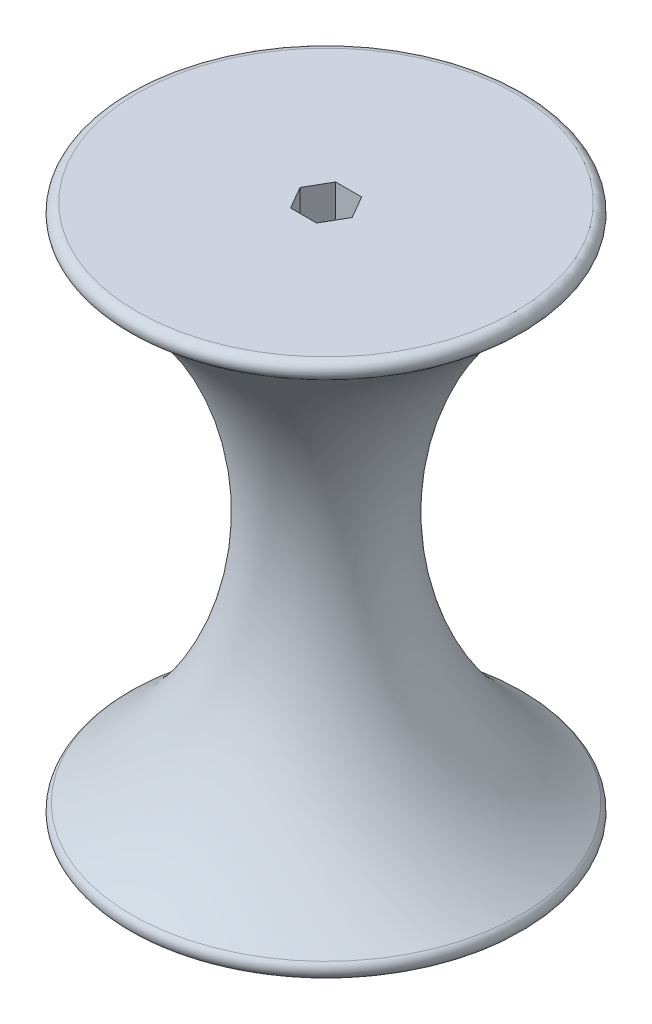
ISO-10303-21;
HEADER;
FILE_DESCRIPTION(('STEP AP214'),'2;1');
FILE_NAME('part.step','',(''),(''),'','','');
FILE_SCHEMA(('AUTOMOTIVE_DESIGN { 1 0 10303 214 1 1 1 1 }'));
ENDSEC;
DATA;
#1=APPLICATION_CONTEXT('core data for automotive mechanical design processes');
#2=APPLICATION_PROTOCOL_DEFINITION('international standard','automotive_design',2000,#1);
#3=PRODUCT_CONTEXT('',#1,'mechanical');
#4=PRODUCT('Part','Part','',(#3));
#5=PRODUCT_RELATED_PRODUCT_CATEGORY('part','',(#4));
#6=PRODUCT_DEFINITION_FORMATION('','',#4);
#7=PRODUCT_DEFINITION_CONTEXT('part definition',#1,'design');
#8=PRODUCT_DEFINITION('design','',#6,#7);
#9=PRODUCT_DEFINITION_SHAPE('','',#8);
#10=(LENGTH_UNIT() NAMED_UNIT(*) SI_UNIT(.MILLI.,.METRE.));
#11=(NAMED_UNIT(*) PLANE_ANGLE_UNIT() SI_UNIT($,.RADIAN.));
#12=(NAMED_UNIT(*) SI_UNIT($,.STERADIAN.) SOLID_ANGLE_UNIT());
#13=UNCERTAINTY_MEASURE_WITH_UNIT(LENGTH_MEASURE(1.E-05),#10,'distance_accuracy_value','');
#14=(GEOMETRIC_REPRESENTATION_CONTEXT(3) GLOBAL_UNCERTAINTY_ASSIGNED_CONTEXT((#13)) GLOBAL_UNIT_ASSIGNED_CONTEXT((#10,
#11,#12)) REPRESENTATION_CONTEXT('',''));
#15=CARTESIAN_POINT('',(0.,0.,0.));
#16=DIRECTION('',(0.,0.,1.));
#17=DIRECTION('',(1.,0.,0.));
#18=AXIS2_PLACEMENT_3D('',#15,#16,#17);
#19=CARTESIAN_POINT('',(0.,-73.66,0.));
#20=DIRECTION('',(0.,-1.,0.));
#21=DIRECTION('',(0.,0.,-1.));
#22=AXIS2_PLACEMENT_3D('',#19,#20,#21);
#23=TOROIDAL_SURFACE('',#22,53.7699483204381,2.54000000000001);
#24=CARTESIAN_POINT('',(0.,-71.6138888888889,0.));
#25=DIRECTION('',(0.,-1.,0.));
#26=DIRECTION('',(0.,0.,-1.));
#27=AXIS2_PLACEMENT_3D('',#24,#25,#26);
#28=CIRCLE('',#27,55.2749497559815);
#29=CARTESIAN_POINT('',(0.,-71.6138888888889,-55.2749497559815));
#30=VERTEX_POINT('',#29);
#31=EDGE_CURVE('E151',#30,#30,#28,.T.);
#32=ORIENTED_EDGE('',*,*,#31,.T.);
#33=EDGE_LOOP('',(#32));
#34=FACE_BOUND('',#33,.T.);
#35=CARTESIAN_POINT('',(0.,-76.2,0.));
#36=DIRECTION('',(0.,-1.,0.));
#37=DIRECTION('',(0.,0.,-1.));
#38=AXIS2_PLACEMENT_3D('',#35,#36,#37);
#39=CIRCLE('',#38,53.7699483204381);
#40=CARTESIAN_POINT('',(0.,-76.2,-53.7699483204381));
#41=VERTEX_POINT('',#40);
#42=EDGE_CURVE('E11',#41,#41,#39,.T.);
#43=ORIENTED_EDGE('',*,*,#42,.F.);
#44=EDGE_LOOP('',(#43));
#45=FACE_BOUND('',#44,.T.);
#46=ADVANCED_FACE('F39',(#34,#45),#23,.T.);
#47=CARTESIAN_POINT('',(0.,-76.2,0.));
#48=DIRECTION('',(0.,-1.,0.));
#49=DIRECTION('',(0.,0.,-1.));
#50=AXIS2_PLACEMENT_3D('',#47,#48,#49);
#51=PLANE('',#50);
#52=DIRECTION('',(-0.500000000000001,0.,-0.866025403784438));
#53=VECTOR('',#52,1.);
#54=CARTESIAN_POINT('',(3.70283595144767,-76.2,-6.4135));
#55=LINE('',#54,#53);
#56=CARTESIAN_POINT('',(7.40567190289534,-76.2,0.));
#57=VERTEX_POINT('',#56);
#58=CARTESIAN_POINT('',(3.70283595144767,-76.2,-6.4135));
#59=VERTEX_POINT('',#58);
#60=EDGE_CURVE('E94',#57,#59,#55,.T.);
#61=ORIENTED_EDGE('',*,*,#60,.T.);
#62=DIRECTION('',(-1.,0.,0.));
#63=VECTOR('',#62,1.);
#64=CARTESIAN_POINT('',(-3.70283595144767,-76.2,-6.4135));
#65=LINE('',#64,#63);
#66=CARTESIAN_POINT('',(-3.70283595144767,-76.2,-6.4135));
#67=VERTEX_POINT('',#66);
#68=EDGE_CURVE('E104',#59,#67,#65,.T.);
#69=ORIENTED_EDGE('',*,*,#68,.T.);
#70=DIRECTION('',(-0.500000000000001,0.,0.866025403784438));
#71=VECTOR('',#70,1.);
#72=CARTESIAN_POINT('',(-7.40567190289534,-76.2,0.));
#73=LINE('',#72,#71);
#74=CARTESIAN_POINT('',(-7.40567190289534,-76.2,0.));
#75=VERTEX_POINT('',#74);
#76=EDGE_CURVE('E54',#67,#75,#73,.T.);
#77=ORIENTED_EDGE('',*,*,#76,.T.);
#78=DIRECTION('',(0.500000000000001,0.,0.866025403784438));
#79=VECTOR('',#78,1.);
#80=CARTESIAN_POINT('',(-3.70283595144767,-76.2,6.4135));
#81=LINE('',#80,#79);
#82=CARTESIAN_POINT('',(-3.70283595144767,-76.2,6.4135));
#83=VERTEX_POINT('',#82);
#84=EDGE_CURVE('E123',#75,#83,#81,.T.);
#85=ORIENTED_EDGE('',*,*,#84,.T.);
#86=DIRECTION('',(1.,0.,0.));
#87=VECTOR('',#86,1.);
#88=CARTESIAN_POINT('',(3.70283595144767,-76.2,6.4135));
#89=LINE('',#88,#87);
#90=CARTESIAN_POINT('',(3.70283595144767,-76.2,6.4135));
#91=VERTEX_POINT('',#90);
#92=EDGE_CURVE('E127',#83,#91,#89,.T.);
#93=ORIENTED_EDGE('',*,*,#92,.T.);
#94=DIRECTION('',(0.500000000000001,0.,-0.866025403784438));
#95=VECTOR('',#94,1.);
#96=CARTESIAN_POINT('',(7.40567190289534,-76.2,0.));
#97=LINE('',#96,#95);
#98=EDGE_CURVE('E101',#91,#57,#97,.T.);
#99=ORIENTED_EDGE('',*,*,#98,.T.);
#100=EDGE_LOOP('',(#61,#69,#77,#85,#93,#99));
#101=FACE_BOUND('',#100,.T.);
#102=ORIENTED_EDGE('',*,*,#42,.T.);
#103=EDGE_LOOP('',(#102));
#104=FACE_BOUND('',#103,.T.);
#105=ADVANCED_FACE('F109',(#101,#104),#51,.T.);
#106=CARTESIAN_POINT('',(0.,76.2,0.));
#107=DIRECTION('',(0.,1.,0.));
#108=DIRECTION('',(0.,0.,1.));
#109=AXIS2_PLACEMENT_3D('',#106,#107,#108);
#110=PLANE('',#109);
#111=DIRECTION('',(-0.500000000000001,0.,-0.866025403784438));
#112=VECTOR('',#111,1.);
#113=CARTESIAN_POINT('',(3.70283595144767,76.2,-6.4135));
#114=LINE('',#113,#112);
#115=CARTESIAN_POINT('',(7.40567190289534,76.2,0.));
#116=VERTEX_POINT('',#115);
#117=CARTESIAN_POINT('',(3.70283595144767,76.2,-6.4135));
#118=VERTEX_POINT('',#117);
#119=EDGE_CURVE('E62',#116,#118,#114,.T.);
#120=ORIENTED_EDGE('',*,*,#119,.F.);
#121=DIRECTION('',(0.500000000000001,0.,-0.866025403784438));
#122=VECTOR('',#121,1.);
#123=CARTESIAN_POINT('',(7.40567190289534,76.2,0.));
#124=LINE('',#123,#122);
#125=CARTESIAN_POINT('',(3.70283595144767,76.2,6.4135));
#126=VERTEX_POINT('',#125);
#127=EDGE_CURVE('E114',#126,#116,#124,.T.);
#128=ORIENTED_EDGE('',*,*,#127,.F.);
#129=DIRECTION('',(1.,0.,0.));
#130=VECTOR('',#129,1.);
#131=CARTESIAN_POINT('',(3.70283595144767,76.2,6.4135));
#132=LINE('',#131,#130);
#133=CARTESIAN_POINT('',(-3.70283595144767,76.2,6.4135));
#134=VERTEX_POINT('',#133);
#135=EDGE_CURVE('E118',#134,#126,#132,.T.);
#136=ORIENTED_EDGE('',*,*,#135,.F.);
#137=DIRECTION('',(0.500000000000001,0.,0.866025403784438));
#138=VECTOR('',#137,1.);
#139=CARTESIAN_POINT('',(-3.70283595144767,76.2,6.4135));
#140=LINE('',#139,#138);
#141=CARTESIAN_POINT('',(-7.40567190289534,76.2,0.));
#142=VERTEX_POINT('',#141);
#143=EDGE_CURVE('E141',#142,#134,#140,.T.);
#144=ORIENTED_EDGE('',*,*,#143,.F.);
#145=DIRECTION('',(-0.500000000000001,0.,0.866025403784438));
#146=VECTOR('',#145,1.);
#147=CARTESIAN_POINT('',(-7.40567190289534,76.2,0.));
#148=LINE('',#147,#146);
#149=CARTESIAN_POINT('',(-3.70283595144767,76.2,-6.4135));
#150=VERTEX_POINT('',#149);
#151=EDGE_CURVE('E137',#150,#142,#148,.T.);
#152=ORIENTED_EDGE('',*,*,#151,.F.);
#153=DIRECTION('',(-1.,0.,0.));
#154=VECTOR('',#153,1.);
#155=CARTESIAN_POINT('',(-3.70283595144767,76.2,-6.4135));
#156=LINE('',#155,#154);
#157=EDGE_CURVE('E134',#118,#150,#156,.T.);
#158=ORIENTED_EDGE('',*,*,#157,.F.);
#159=EDGE_LOOP('',(#120,#128,#136,#144,#152,#158));
#160=FACE_BOUND('',#159,.T.);
#161=CARTESIAN_POINT('',(0.,76.2,0.));
#162=DIRECTION('',(0.,-1.,0.));
#163=DIRECTION('',(0.,0.,-1.));
#164=AXIS2_PLACEMENT_3D('',#161,#162,#163);
#165=CIRCLE('',#164,53.7699483204381);
#166=CARTESIAN_POINT('',(0.,76.2,-53.7699483204381));
#167=VERTEX_POINT('',#166);
#168=EDGE_CURVE('E47',#167,#167,#165,.T.);
#169=ORIENTED_EDGE('',*,*,#168,.F.);
#170=EDGE_LOOP('',(#169));
#171=FACE_BOUND('',#170,.T.);
#172=ADVANCED_FACE('F176',(#160,#171),#110,.T.);
#173=CARTESIAN_POINT('',(0.,73.66,0.));
#174=DIRECTION('',(0.,-1.,0.));
#175=DIRECTION('',(0.,0.,-1.));
#176=AXIS2_PLACEMENT_3D('',#173,#174,#175);
#177=TOROIDAL_SURFACE('',#176,53.7699483204381,2.54000000000001);
#178=ORIENTED_EDGE('',*,*,#168,.T.);
#179=EDGE_LOOP('',(#178));
#180=FACE_BOUND('',#179,.T.);
#181=CARTESIAN_POINT('',(0.,71.6138888888889,0.));
#182=DIRECTION('',(0.,-1.,0.));
#183=DIRECTION('',(0.,0.,-1.));
#184=AXIS2_PLACEMENT_3D('',#181,#182,#183);
#185=CIRCLE('',#184,55.2749497559815);
#186=CARTESIAN_POINT('',(0.,71.6138888888889,-55.2749497559815));
#187=VERTEX_POINT('',#186);
#188=EDGE_CURVE('E166',#187,#187,#185,.T.);
#189=ORIENTED_EDGE('',*,*,#188,.F.);
#190=EDGE_LOOP('',(#189));
#191=FACE_BOUND('',#190,.T.);
#192=ADVANCED_FACE('F173',(#180,#191),#177,.T.);
#193=CARTESIAN_POINT('',(0.,0.,0.));
#194=DIRECTION('',(0.,-1.,0.));
#195=DIRECTION('',(0.,0.,-1.));
#196=AXIS2_PLACEMENT_3D('',#193,#194,#195);
#197=TOROIDAL_SURFACE('',#196,107.95,88.9);
#198=ORIENTED_EDGE('',*,*,#188,.T.);
#199=EDGE_LOOP('',(#198));
#200=FACE_BOUND('',#199,.T.);
#201=ORIENTED_EDGE('',*,*,#31,.F.);
#202=EDGE_LOOP('',(#201));
#203=FACE_BOUND('',#202,.T.);
#204=ADVANCED_FACE('F184',(#200,#203),#197,.F.);
#205=CARTESIAN_POINT('',(3.70283595144767,-76.2,-6.4135));
#206=DIRECTION('',(0.866025403784438,0.,-0.500000000000001));
#207=DIRECTION('',(-0.500000000000001,0.,-0.866025403784438));
#208=AXIS2_PLACEMENT_3D('',#205,#206,#207);
#209=PLANE('',#208);
#210=ORIENTED_EDGE('',*,*,#119,.T.);
#211=DIRECTION('',(0.,1.,0.));
#212=VECTOR('',#211,1.);
#213=CARTESIAN_POINT('',(3.70283595144767,-76.2,-6.4135));
#214=LINE('',#213,#212);
#215=EDGE_CURVE('E90',#59,#118,#214,.T.);
#216=ORIENTED_EDGE('',*,*,#215,.F.);
#217=ORIENTED_EDGE('',*,*,#60,.F.);
#218=DIRECTION('',(0.,1.,0.));
#219=VECTOR('',#218,1.);
#220=CARTESIAN_POINT('',(7.40567190289534,-76.2,0.));
#221=LINE('',#220,#219);
#222=EDGE_CURVE('E148',#57,#116,#221,.T.);
#223=ORIENTED_EDGE('',*,*,#222,.T.);
#224=EDGE_LOOP('',(#210,#216,#217,#223));
#225=FACE_BOUND('',#224,.T.);
#226=ADVANCED_FACE('F92',(#225),#209,.F.);
#227=CARTESIAN_POINT('',(7.40567190289534,-76.2,0.));
#228=DIRECTION('',(0.866025403784438,0.,0.500000000000001));
#229=DIRECTION('',(0.500000000000001,0.,-0.866025403784438));
#230=AXIS2_PLACEMENT_3D('',#227,#228,#229);
#231=PLANE('',#230);
#232=ORIENTED_EDGE('',*,*,#127,.T.);
#233=ORIENTED_EDGE('',*,*,#222,.F.);
#234=ORIENTED_EDGE('',*,*,#98,.F.);
#235=DIRECTION('',(0.,1.,0.));
#236=VECTOR('',#235,1.);
#237=CARTESIAN_POINT('',(3.70283595144767,-76.2,6.4135));
#238=LINE('',#237,#236);
#239=EDGE_CURVE('E152',#91,#126,#238,.T.);
#240=ORIENTED_EDGE('',*,*,#239,.T.);
#241=EDGE_LOOP('',(#232,#233,#234,#240));
#242=FACE_BOUND('',#241,.T.);
#243=ADVANCED_FACE('F200',(#242),#231,.F.);
#244=CARTESIAN_POINT('',(3.70283595144767,-76.2,6.4135));
#245=DIRECTION('',(0.,0.,1.));
#246=DIRECTION('',(1.,0.,0.));
#247=AXIS2_PLACEMENT_3D('',#244,#245,#246);
#248=PLANE('',#247);
#249=ORIENTED_EDGE('',*,*,#135,.T.);
#250=ORIENTED_EDGE('',*,*,#239,.F.);
#251=ORIENTED_EDGE('',*,*,#92,.F.);
#252=DIRECTION('',(0.,1.,0.));
#253=VECTOR('',#252,1.);
#254=CARTESIAN_POINT('',(-3.70283595144767,-76.2,6.4135));
#255=LINE('',#254,#253);
#256=EDGE_CURVE('E155',#83,#134,#255,.T.);
#257=ORIENTED_EDGE('',*,*,#256,.T.);
#258=EDGE_LOOP('',(#249,#250,#251,#257));
#259=FACE_BOUND('',#258,.T.);
#260=ADVANCED_FACE('F211',(#259),#248,.F.);
#261=CARTESIAN_POINT('',(-3.70283595144767,-76.2,6.4135));
#262=DIRECTION('',(-0.866025403784438,0.,0.500000000000001));
#263=DIRECTION('',(0.500000000000001,0.,0.866025403784438));
#264=AXIS2_PLACEMENT_3D('',#261,#262,#263);
#265=PLANE('',#264);
#266=ORIENTED_EDGE('',*,*,#143,.T.);
#267=ORIENTED_EDGE('',*,*,#256,.F.);
#268=ORIENTED_EDGE('',*,*,#84,.F.);
#269=DIRECTION('',(0.,1.,0.));
#270=VECTOR('',#269,1.);
#271=CARTESIAN_POINT('',(-7.40567190289534,-76.2,0.));
#272=LINE('',#271,#270);
#273=EDGE_CURVE('E158',#75,#142,#272,.T.);
#274=ORIENTED_EDGE('',*,*,#273,.T.);
#275=EDGE_LOOP('',(#266,#267,#268,#274));
#276=FACE_BOUND('',#275,.T.);
#277=ADVANCED_FACE('F208',(#276),#265,.F.);
#278=CARTESIAN_POINT('',(-7.40567190289534,-76.2,0.));
#279=DIRECTION('',(-0.866025403784438,0.,-0.500000000000001));
#280=DIRECTION('',(-0.500000000000001,0.,0.866025403784438));
#281=AXIS2_PLACEMENT_3D('',#278,#279,#280);
#282=PLANE('',#281);
#283=ORIENTED_EDGE('',*,*,#151,.T.);
#284=ORIENTED_EDGE('',*,*,#273,.F.);
#285=ORIENTED_EDGE('',*,*,#76,.F.);
#286=DIRECTION('',(0.,1.,0.));
#287=VECTOR('',#286,1.);
#288=CARTESIAN_POINT('',(-3.70283595144767,-76.2,-6.4135));
#289=LINE('',#288,#287);
#290=EDGE_CURVE('E100',#67,#150,#289,.T.);
#291=ORIENTED_EDGE('',*,*,#290,.T.);
#292=EDGE_LOOP('',(#283,#284,#285,#291));
#293=FACE_BOUND('',#292,.T.);
#294=ADVANCED_FACE('F205',(#293),#282,.F.);
#295=CARTESIAN_POINT('',(-3.70283595144767,-76.2,-6.4135));
#296=DIRECTION('',(0.,0.,-1.));
#297=DIRECTION('',(-1.,0.,0.));
#298=AXIS2_PLACEMENT_3D('',#295,#296,#297);
#299=PLANE('',#298);
#300=ORIENTED_EDGE('',*,*,#157,.T.);
#301=ORIENTED_EDGE('',*,*,#290,.F.);
#302=ORIENTED_EDGE('',*,*,#68,.F.);
#303=ORIENTED_EDGE('',*,*,#215,.T.);
#304=EDGE_LOOP('',(#300,#301,#302,#303));
#305=FACE_BOUND('',#304,.T.);
#306=ADVANCED_FACE('F105',(#305),#299,.F.);
#307=CLOSED_SHELL('',(#46,#105,#172,#192,#204,#226,#243,#260,#277,#294,#306));
#308=MANIFOLD_SOLID_BREP('B2',#307);
#309=ADVANCED_BREP_SHAPE_REPRESENTATION('',(#18,#308),#14);
#310=SHAPE_DEFINITION_REPRESENTATION(#9,#309);
ENDSEC;
END-ISO-10303-21;
